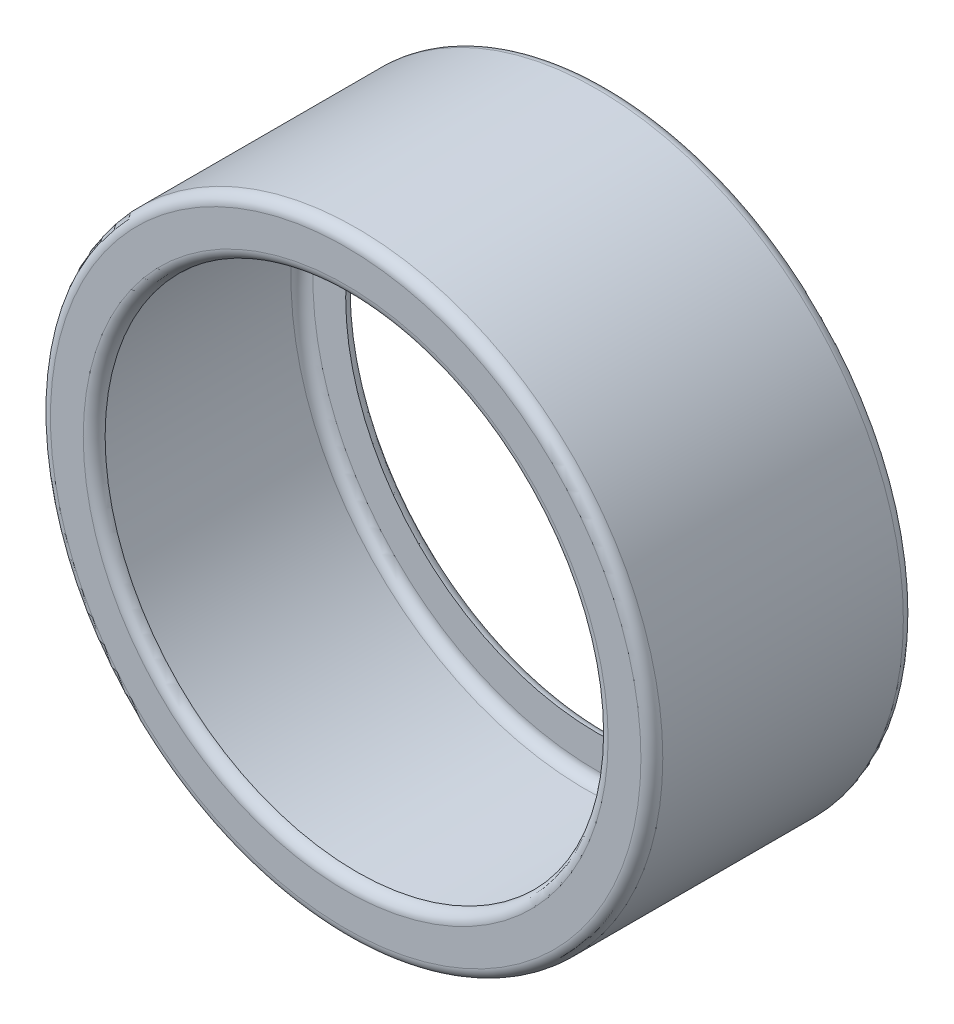
ISO-10303-21;
HEADER;
FILE_DESCRIPTION(('STEP AP214'),'2;1');
FILE_NAME('part.step','',(''),(''),'','','');
FILE_SCHEMA(('AUTOMOTIVE_DESIGN { 1 0 10303 214 1 1 1 1 }'));
ENDSEC;
DATA;
#1=APPLICATION_CONTEXT('core data for automotive mechanical design processes');
#2=APPLICATION_PROTOCOL_DEFINITION('international standard','automotive_design',2000,#1);
#3=PRODUCT_CONTEXT('',#1,'mechanical');
#4=PRODUCT('Part','Part','',(#3));
#5=PRODUCT_RELATED_PRODUCT_CATEGORY('part','',(#4));
#6=PRODUCT_DEFINITION_FORMATION('','',#4);
#7=PRODUCT_DEFINITION_CONTEXT('part definition',#1,'design');
#8=PRODUCT_DEFINITION('design','',#6,#7);
#9=PRODUCT_DEFINITION_SHAPE('','',#8);
#10=(LENGTH_UNIT() NAMED_UNIT(*) SI_UNIT(.MILLI.,.METRE.));
#11=(NAMED_UNIT(*) PLANE_ANGLE_UNIT() SI_UNIT($,.RADIAN.));
#12=(NAMED_UNIT(*) SI_UNIT($,.STERADIAN.) SOLID_ANGLE_UNIT());
#13=UNCERTAINTY_MEASURE_WITH_UNIT(LENGTH_MEASURE(1.E-05),#10,'distance_accuracy_value','');
#14=(GEOMETRIC_REPRESENTATION_CONTEXT(3) GLOBAL_UNCERTAINTY_ASSIGNED_CONTEXT((#13)) GLOBAL_UNIT_ASSIGNED_CONTEXT((#10,
#11,#12)) REPRESENTATION_CONTEXT('',''));
#15=CARTESIAN_POINT('',(0.,0.,0.));
#16=DIRECTION('',(0.,0.,1.));
#17=DIRECTION('',(1.,0.,0.));
#18=AXIS2_PLACEMENT_3D('',#15,#16,#17);
#19=CARTESIAN_POINT('',(0.,0.,24.));
#20=DIRECTION('',(0.,0.,1.));
#21=DIRECTION('',(1.,0.,0.));
#22=AXIS2_PLACEMENT_3D('',#19,#20,#21);
#23=PLANE('',#22);
#24=CARTESIAN_POINT('',(0.,0.,24.));
#25=DIRECTION('',(0.,0.,1.));
#26=DIRECTION('',(1.,0.,0.));
#27=AXIS2_PLACEMENT_3D('',#24,#25,#26);
#28=CIRCLE('',#27,24.);
#29=CARTESIAN_POINT('',(24.,0.,24.));
#30=VERTEX_POINT('',#29);
#31=EDGE_CURVE('E58',#30,#30,#28,.F.);
#32=ORIENTED_EDGE('',*,*,#31,.T.);
#33=EDGE_LOOP('',(#32));
#34=FACE_BOUND('',#33,.T.);
#35=CARTESIAN_POINT('',(0.,0.,24.));
#36=DIRECTION('',(0.,0.,1.));
#37=DIRECTION('',(1.,0.,0.));
#38=AXIS2_PLACEMENT_3D('',#35,#36,#37);
#39=CIRCLE('',#38,27.);
#40=CARTESIAN_POINT('',(27.,0.,24.));
#41=VERTEX_POINT('',#40);
#42=EDGE_CURVE('E61',#41,#41,#39,.T.);
#43=ORIENTED_EDGE('',*,*,#42,.T.);
#44=EDGE_LOOP('',(#43));
#45=FACE_BOUND('',#44,.T.);
#46=ADVANCED_FACE('F32',(#34,#45),#23,.T.);
#47=CARTESIAN_POINT('',(0.,0.,0.));
#48=DIRECTION('',(0.,0.,1.));
#49=DIRECTION('',(1.,0.,0.));
#50=AXIS2_PLACEMENT_3D('',#47,#48,#49);
#51=PLANE('',#50);
#52=CARTESIAN_POINT('',(0.,0.,0.));
#53=DIRECTION('',(0.,0.,1.));
#54=DIRECTION('',(1.,0.,0.));
#55=AXIS2_PLACEMENT_3D('',#52,#53,#54);
#56=CIRCLE('',#55,24.);
#57=CARTESIAN_POINT('',(24.,0.,0.));
#58=VERTEX_POINT('',#57);
#59=EDGE_CURVE('E64',#58,#58,#56,.T.);
#60=ORIENTED_EDGE('',*,*,#59,.T.);
#61=EDGE_LOOP('',(#60));
#62=FACE_BOUND('',#61,.T.);
#63=CARTESIAN_POINT('',(0.,0.,0.));
#64=DIRECTION('',(0.,0.,1.));
#65=DIRECTION('',(1.,0.,0.));
#66=AXIS2_PLACEMENT_3D('',#63,#64,#65);
#67=CIRCLE('',#66,27.);
#68=CARTESIAN_POINT('',(27.,0.,0.));
#69=VERTEX_POINT('',#68);
#70=EDGE_CURVE('E67',#69,#69,#67,.F.);
#71=ORIENTED_EDGE('',*,*,#70,.T.);
#72=EDGE_LOOP('',(#71));
#73=FACE_BOUND('',#72,.T.);
#74=ADVANCED_FACE('F97',(#62,#73),#51,.F.);
#75=CARTESIAN_POINT('',(0.,0.,24.));
#76=DIRECTION('',(0.,0.,-1.));
#77=DIRECTION('',(-1.,0.,0.));
#78=AXIS2_PLACEMENT_3D('',#75,#76,#77);
#79=CYLINDRICAL_SURFACE('',#78,28.);
#80=CARTESIAN_POINT('',(0.,0.,1.));
#81=DIRECTION('',(0.,0.,1.));
#82=DIRECTION('',(1.,0.,0.));
#83=AXIS2_PLACEMENT_3D('',#80,#81,#82);
#84=CIRCLE('',#83,28.);
#85=CARTESIAN_POINT('',(28.,0.,1.));
#86=VERTEX_POINT('',#85);
#87=EDGE_CURVE('E52',#86,#86,#84,.T.);
#88=ORIENTED_EDGE('',*,*,#87,.T.);
#89=EDGE_LOOP('',(#88));
#90=FACE_BOUND('',#89,.T.);
#91=CARTESIAN_POINT('',(0.,0.,23.));
#92=DIRECTION('',(0.,0.,1.));
#93=DIRECTION('',(1.,0.,0.));
#94=AXIS2_PLACEMENT_3D('',#91,#92,#93);
#95=CIRCLE('',#94,28.);
#96=CARTESIAN_POINT('',(28.,0.,23.));
#97=VERTEX_POINT('',#96);
#98=EDGE_CURVE('E55',#97,#97,#95,.F.);
#99=ORIENTED_EDGE('',*,*,#98,.T.);
#100=EDGE_LOOP('',(#99));
#101=FACE_BOUND('',#100,.T.);
#102=ADVANCED_FACE('F92',(#90,#101),#79,.T.);
#103=CARTESIAN_POINT('',(0.,0.,1.));
#104=DIRECTION('',(0.,0.,1.));
#105=DIRECTION('',(1.,0.,0.));
#106=AXIS2_PLACEMENT_3D('',#103,#104,#105);
#107=TOROIDAL_SURFACE('',#106,24.,1.);
#108=CARTESIAN_POINT('',(0.,0.,1.));
#109=DIRECTION('',(0.,0.,1.));
#110=DIRECTION('',(1.,0.,0.));
#111=AXIS2_PLACEMENT_3D('',#108,#109,#110);
#112=CIRCLE('',#111,23.);
#113=CARTESIAN_POINT('',(23.,0.,1.));
#114=VERTEX_POINT('',#113);
#115=EDGE_CURVE('E71',#114,#114,#112,.T.);
#116=ORIENTED_EDGE('',*,*,#115,.T.);
#117=EDGE_LOOP('',(#116));
#118=FACE_BOUND('',#117,.T.);
#119=ORIENTED_EDGE('',*,*,#59,.F.);
#120=EDGE_LOOP('',(#119));
#121=FACE_BOUND('',#120,.T.);
#122=ADVANCED_FACE('F82',(#118,#121),#107,.T.);
#123=CARTESIAN_POINT('',(0.,0.,23.));
#124=DIRECTION('',(0.,0.,1.));
#125=DIRECTION('',(1.,0.,0.));
#126=AXIS2_PLACEMENT_3D('',#123,#124,#125);
#127=TOROIDAL_SURFACE('',#126,24.,1.);
#128=ORIENTED_EDGE('',*,*,#31,.F.);
#129=EDGE_LOOP('',(#128));
#130=FACE_BOUND('',#129,.T.);
#131=CARTESIAN_POINT('',(0.,0.,23.));
#132=DIRECTION('',(0.,0.,1.));
#133=DIRECTION('',(1.,0.,0.));
#134=AXIS2_PLACEMENT_3D('',#131,#132,#133);
#135=CIRCLE('',#134,23.);
#136=CARTESIAN_POINT('',(23.,0.,23.));
#137=VERTEX_POINT('',#136);
#138=EDGE_CURVE('E70',#137,#137,#135,.T.);
#139=ORIENTED_EDGE('',*,*,#138,.F.);
#140=EDGE_LOOP('',(#139));
#141=FACE_BOUND('',#140,.T.);
#142=ADVANCED_FACE('F79',(#130,#141),#127,.T.);
#143=CARTESIAN_POINT('',(0.,0.,1.));
#144=DIRECTION('',(0.,0.,1.));
#145=DIRECTION('',(1.,0.,0.));
#146=AXIS2_PLACEMENT_3D('',#143,#144,#145);
#147=TOROIDAL_SURFACE('',#146,27.,1.);
#148=ORIENTED_EDGE('',*,*,#70,.F.);
#149=EDGE_LOOP('',(#148));
#150=FACE_BOUND('',#149,.T.);
#151=ORIENTED_EDGE('',*,*,#87,.F.);
#152=EDGE_LOOP('',(#151));
#153=FACE_BOUND('',#152,.T.);
#154=ADVANCED_FACE('F81',(#150,#153),#147,.T.);
#155=CARTESIAN_POINT('',(0.,0.,23.));
#156=DIRECTION('',(0.,0.,1.));
#157=DIRECTION('',(1.,0.,0.));
#158=AXIS2_PLACEMENT_3D('',#155,#156,#157);
#159=TOROIDAL_SURFACE('',#158,27.,1.);
#160=ORIENTED_EDGE('',*,*,#98,.F.);
#161=EDGE_LOOP('',(#160));
#162=FACE_BOUND('',#161,.T.);
#163=ORIENTED_EDGE('',*,*,#42,.F.);
#164=EDGE_LOOP('',(#163));
#165=FACE_BOUND('',#164,.T.);
#166=ADVANCED_FACE('F89',(#162,#165),#159,.T.);
#167=CARTESIAN_POINT('',(0.,0.,23.));
#168=DIRECTION('',(0.,0.,1.));
#169=DIRECTION('',(1.,0.,0.));
#170=AXIS2_PLACEMENT_3D('',#167,#168,#169);
#171=PLANE('',#170);
#172=CARTESIAN_POINT('',(0.,0.,23.));
#173=DIRECTION('',(0.,0.,1.));
#174=DIRECTION('',(1.,0.,0.));
#175=AXIS2_PLACEMENT_3D('',#172,#173,#174);
#176=CIRCLE('',#175,26.);
#177=CARTESIAN_POINT('',(26.,0.,23.));
#178=VERTEX_POINT('',#177);
#179=EDGE_CURVE('E39',#178,#178,#176,.F.);
#180=ORIENTED_EDGE('',*,*,#179,.T.);
#181=EDGE_LOOP('',(#180));
#182=FACE_BOUND('',#181,.T.);
#183=ORIENTED_EDGE('',*,*,#138,.T.);
#184=EDGE_LOOP('',(#183));
#185=FACE_BOUND('',#184,.T.);
#186=ADVANCED_FACE('F77',(#182,#185),#171,.F.);
#187=CARTESIAN_POINT('',(0.,0.,1.));
#188=DIRECTION('',(0.,0.,1.));
#189=DIRECTION('',(1.,0.,0.));
#190=AXIS2_PLACEMENT_3D('',#187,#188,#189);
#191=PLANE('',#190);
#192=CARTESIAN_POINT('',(0.,0.,1.));
#193=DIRECTION('',(0.,0.,1.));
#194=DIRECTION('',(1.,0.,0.));
#195=AXIS2_PLACEMENT_3D('',#192,#193,#194);
#196=CIRCLE('',#195,26.);
#197=CARTESIAN_POINT('',(26.,0.,1.));
#198=VERTEX_POINT('',#197);
#199=EDGE_CURVE('E10',#198,#198,#196,.T.);
#200=ORIENTED_EDGE('',*,*,#199,.T.);
#201=EDGE_LOOP('',(#200));
#202=FACE_BOUND('',#201,.T.);
#203=ORIENTED_EDGE('',*,*,#115,.F.);
#204=EDGE_LOOP('',(#203));
#205=FACE_BOUND('',#204,.T.);
#206=ADVANCED_FACE('F125',(#202,#205),#191,.T.);
#207=CARTESIAN_POINT('',(0.,0.,24.));
#208=DIRECTION('',(0.,0.,-1.));
#209=DIRECTION('',(-1.,0.,0.));
#210=AXIS2_PLACEMENT_3D('',#207,#208,#209);
#211=CYLINDRICAL_SURFACE('',#210,27.);
#212=CARTESIAN_POINT('',(0.,0.,22.));
#213=DIRECTION('',(0.,0.,1.));
#214=DIRECTION('',(1.,0.,0.));
#215=AXIS2_PLACEMENT_3D('',#212,#213,#214);
#216=CIRCLE('',#215,27.);
#217=CARTESIAN_POINT('',(27.,0.,22.));
#218=VERTEX_POINT('',#217);
#219=EDGE_CURVE('E43',#218,#218,#216,.T.);
#220=ORIENTED_EDGE('',*,*,#219,.T.);
#221=EDGE_LOOP('',(#220));
#222=FACE_BOUND('',#221,.T.);
#223=CARTESIAN_POINT('',(0.,0.,2.));
#224=DIRECTION('',(0.,0.,1.));
#225=DIRECTION('',(1.,0.,0.));
#226=AXIS2_PLACEMENT_3D('',#223,#224,#225);
#227=CIRCLE('',#226,27.);
#228=CARTESIAN_POINT('',(27.,0.,2.));
#229=VERTEX_POINT('',#228);
#230=EDGE_CURVE('E47',#229,#229,#227,.F.);
#231=ORIENTED_EDGE('',*,*,#230,.T.);
#232=EDGE_LOOP('',(#231));
#233=FACE_BOUND('',#232,.T.);
#234=ADVANCED_FACE('F107',(#222,#233),#211,.F.);
#235=CARTESIAN_POINT('',(0.,0.,22.));
#236=DIRECTION('',(0.,0.,1.));
#237=DIRECTION('',(1.,0.,0.));
#238=AXIS2_PLACEMENT_3D('',#235,#236,#237);
#239=TOROIDAL_SURFACE('',#238,26.,1.);
#240=ORIENTED_EDGE('',*,*,#179,.F.);
#241=EDGE_LOOP('',(#240));
#242=FACE_BOUND('',#241,.T.);
#243=ORIENTED_EDGE('',*,*,#219,.F.);
#244=EDGE_LOOP('',(#243));
#245=FACE_BOUND('',#244,.T.);
#246=ADVANCED_FACE('F127',(#242,#245),#239,.F.);
#247=CARTESIAN_POINT('',(0.,0.,2.));
#248=DIRECTION('',(0.,0.,1.));
#249=DIRECTION('',(1.,0.,0.));
#250=AXIS2_PLACEMENT_3D('',#247,#248,#249);
#251=TOROIDAL_SURFACE('',#250,26.,1.);
#252=ORIENTED_EDGE('',*,*,#230,.F.);
#253=EDGE_LOOP('',(#252));
#254=FACE_BOUND('',#253,.T.);
#255=ORIENTED_EDGE('',*,*,#199,.F.);
#256=EDGE_LOOP('',(#255));
#257=FACE_BOUND('',#256,.T.);
#258=ADVANCED_FACE('F34',(#254,#257),#251,.F.);
#259=CLOSED_SHELL('',(#46,#74,#102,#122,#142,#154,#166,#186,#206,#234,#246,#258));
#260=MANIFOLD_SOLID_BREP('B2',#259);
#261=ADVANCED_BREP_SHAPE_REPRESENTATION('',(#18,#260),#14);
#262=SHAPE_DEFINITION_REPRESENTATION(#9,#261);
ENDSEC;
END-ISO-10303-21;
